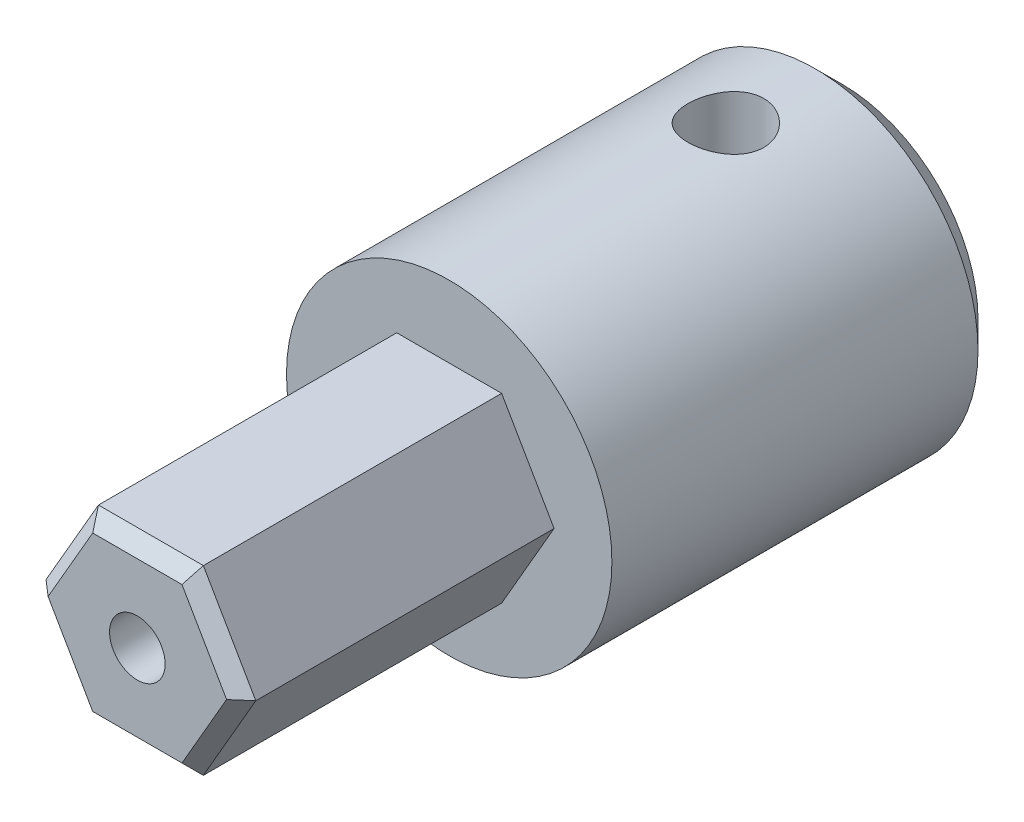
ISO-10303-21;
HEADER;
FILE_DESCRIPTION(('STEP AP214'),'2;1');
FILE_NAME('part.step','',(''),(''),'','','');
FILE_SCHEMA(('AUTOMOTIVE_DESIGN { 1 0 10303 214 1 1 1 1 }'));
ENDSEC;
DATA;
#1=APPLICATION_CONTEXT('core data for automotive mechanical design processes');
#2=APPLICATION_PROTOCOL_DEFINITION('international standard','automotive_design',2000,#1);
#3=PRODUCT_CONTEXT('',#1,'mechanical');
#4=PRODUCT('Part','Part','',(#3));
#5=PRODUCT_RELATED_PRODUCT_CATEGORY('part','',(#4));
#6=PRODUCT_DEFINITION_FORMATION('','',#4);
#7=PRODUCT_DEFINITION_CONTEXT('part definition',#1,'design');
#8=PRODUCT_DEFINITION('design','',#6,#7);
#9=PRODUCT_DEFINITION_SHAPE('','',#8);
#10=(LENGTH_UNIT() NAMED_UNIT(*) SI_UNIT(.MILLI.,.METRE.));
#11=(NAMED_UNIT(*) PLANE_ANGLE_UNIT() SI_UNIT($,.RADIAN.));
#12=(NAMED_UNIT(*) SI_UNIT($,.STERADIAN.) SOLID_ANGLE_UNIT());
#13=UNCERTAINTY_MEASURE_WITH_UNIT(LENGTH_MEASURE(1.E-05),#10,'distance_accuracy_value','');
#14=(GEOMETRIC_REPRESENTATION_CONTEXT(3) GLOBAL_UNCERTAINTY_ASSIGNED_CONTEXT((#13)) GLOBAL_UNIT_ASSIGNED_CONTEXT((#10,
#11,#12)) REPRESENTATION_CONTEXT('',''));
#15=CARTESIAN_POINT('',(0.,0.,0.));
#16=DIRECTION('',(0.,0.,1.));
#17=DIRECTION('',(1.,0.,0.));
#18=AXIS2_PLACEMENT_3D('',#15,#16,#17);
#19=CARTESIAN_POINT('',(0.,0.,14.5));
#20=DIRECTION('',(0.,0.,1.));
#21=DIRECTION('',(1.,0.,0.));
#22=AXIS2_PLACEMENT_3D('',#19,#20,#21);
#23=PLANE('',#22);
#24=CARTESIAN_POINT('',(0.,0.,14.5));
#25=DIRECTION('',(0.,0.,1.));
#26=DIRECTION('',(1.,0.,0.));
#27=AXIS2_PLACEMENT_3D('',#24,#25,#26);
#28=CIRCLE('',#27,6.);
#29=CARTESIAN_POINT('',(6.,0.,14.5));
#30=VERTEX_POINT('',#29);
#31=EDGE_CURVE('E164',#30,#30,#28,.T.);
#32=ORIENTED_EDGE('',*,*,#31,.T.);
#33=EDGE_LOOP('',(#32));
#34=FACE_BOUND('',#33,.T.);
#35=DIRECTION('',(-0.5,0.866025403784438,0.));
#36=VECTOR('',#35,1.);
#37=CARTESIAN_POINT('',(3.86824680357049,0.,14.5));
#38=LINE('',#37,#36);
#39=CARTESIAN_POINT('',(3.86824680357049,0.,14.5));
#40=VERTEX_POINT('',#39);
#41=CARTESIAN_POINT('',(1.93412340178525,3.35,14.5));
#42=VERTEX_POINT('',#41);
#43=EDGE_CURVE('E131',#40,#42,#38,.T.);
#44=ORIENTED_EDGE('',*,*,#43,.F.);
#45=DIRECTION('',(0.5,0.866025403784439,0.));
#46=VECTOR('',#45,1.);
#47=CARTESIAN_POINT('',(1.93412340178525,-3.35,14.5));
#48=LINE('',#47,#46);
#49=CARTESIAN_POINT('',(1.93412340178525,-3.35,14.5));
#50=VERTEX_POINT('',#49);
#51=EDGE_CURVE('E127',#50,#40,#48,.T.);
#52=ORIENTED_EDGE('',*,*,#51,.F.);
#53=DIRECTION('',(1.,0.,0.));
#54=VECTOR('',#53,1.);
#55=CARTESIAN_POINT('',(-1.93412340178524,-3.35,14.5));
#56=LINE('',#55,#54);
#57=CARTESIAN_POINT('',(-1.93412340178524,-3.35,14.5));
#58=VERTEX_POINT('',#57);
#59=EDGE_CURVE('E149',#58,#50,#56,.T.);
#60=ORIENTED_EDGE('',*,*,#59,.F.);
#61=DIRECTION('',(0.5,-0.866025403784439,0.));
#62=VECTOR('',#61,1.);
#63=CARTESIAN_POINT('',(-3.86824680357049,0.,14.5));
#64=LINE('',#63,#62);
#65=CARTESIAN_POINT('',(-3.86824680357049,0.,14.5));
#66=VERTEX_POINT('',#65);
#67=EDGE_CURVE('E146',#66,#58,#64,.T.);
#68=ORIENTED_EDGE('',*,*,#67,.F.);
#69=DIRECTION('',(-0.5,-0.866025403784439,0.));
#70=VECTOR('',#69,1.);
#71=CARTESIAN_POINT('',(-1.93412340178525,3.35,14.5));
#72=LINE('',#71,#70);
#73=CARTESIAN_POINT('',(-1.93412340178525,3.35,14.5));
#74=VERTEX_POINT('',#73);
#75=EDGE_CURVE('E143',#74,#66,#72,.T.);
#76=ORIENTED_EDGE('',*,*,#75,.F.);
#77=DIRECTION('',(-1.,0.,0.));
#78=VECTOR('',#77,1.);
#79=CARTESIAN_POINT('',(1.93412340178525,3.35,14.5));
#80=LINE('',#79,#78);
#81=EDGE_CURVE('E140',#42,#74,#80,.T.);
#82=ORIENTED_EDGE('',*,*,#81,.F.);
#83=EDGE_LOOP('',(#44,#52,#60,#68,#76,#82));
#84=FACE_BOUND('',#83,.T.);
#85=ADVANCED_FACE('F41',(#34,#84),#23,.T.);
#86=CARTESIAN_POINT('',(0.,0.,14.5));
#87=DIRECTION('',(0.,0.,-1.));
#88=DIRECTION('',(-1.,0.,0.));
#89=AXIS2_PLACEMENT_3D('',#86,#87,#88);
#90=CYLINDRICAL_SURFACE('',#89,6.);
#91=CARTESIAN_POINT('',(0.,6.,5.7));
#92=CARTESIAN_POINT('',(-0.0775136551808606,5.99999860462077,5.69999755049782));
#93=CARTESIAN_POINT('',(-0.155055852180418,5.99848277720664,5.69354075895642));
#94=CARTESIAN_POINT('',(-0.307928711689404,5.99258245110673,5.66791633869285));
#95=CARTESIAN_POINT('',(-0.383257908738774,5.98819609437492,5.64874047701852));
#96=CARTESIAN_POINT('',(-0.529474135819814,5.97704189804572,5.59831831024663));
#97=CARTESIAN_POINT('',(-0.600366020559868,5.97027671664972,5.5670854743364));
#98=CARTESIAN_POINT('',(-0.735902456221209,5.95509063862421,5.49348083405209));
#99=CARTESIAN_POINT('',(-0.800546997673411,5.94666973948518,5.45110901279503));
#100=CARTESIAN_POINT('',(-0.922925959248793,5.92892044055307,5.35561764001887));
#101=CARTESIAN_POINT('',(-0.980531045796355,5.91957951935363,5.30233465382949));
#102=CARTESIAN_POINT('',(-1.08607323847069,5.90112886617325,5.18688389689762));
#103=CARTESIAN_POINT('',(-1.13400938392729,5.89201915724322,5.12471524435569));
#104=CARTESIAN_POINT('',(-1.21944051732307,5.87493771504315,4.99227998295129));
#105=CARTESIAN_POINT('',(-1.25679466710317,5.86698196255307,4.92192027567549));
#106=CARTESIAN_POINT('',(-1.31909703704768,5.85329030120377,4.77570531126446));
#107=CARTESIAN_POINT('',(-1.34404696295362,5.84755408715332,4.69985081137895));
#108=CARTESIAN_POINT('',(-1.38039896443522,5.83907906254273,4.54621138233285));
#109=CARTESIAN_POINT('',(-1.39203167018675,5.83628929295491,4.46848389510076));
#110=CARTESIAN_POINT('',(-1.40213672759817,5.83387021717826,4.31213439110955));
#111=CARTESIAN_POINT('',(-1.40061093007045,5.83424046651614,4.23351250170633));
#112=CARTESIAN_POINT('',(-1.38462717006806,5.83805360607404,4.07934410285429));
#113=CARTESIAN_POINT('',(-1.37044019131594,5.84143210805626,4.00376766136065));
#114=CARTESIAN_POINT('',(-1.32996743878963,5.85077891648779,3.85609814039352));
#115=CARTESIAN_POINT('',(-1.30368090292846,5.85674738606409,3.78400528064847));
#116=CARTESIAN_POINT('',(-1.23951455308861,5.87066310630364,3.64460351510234));
#117=CARTESIAN_POINT('',(-1.20153320055199,5.87862756950202,3.57734313734968));
#118=CARTESIAN_POINT('',(-1.11512658099994,5.89562771298769,3.45005155389481));
#119=CARTESIAN_POINT('',(-1.06669970611106,5.90466355809567,3.39002146336614));
#120=CARTESIAN_POINT('',(-0.959356121021581,5.92306231054005,3.27733750874245));
#121=CARTESIAN_POINT('',(-0.900209750657103,5.93242778207154,3.2249025965754));
#122=CARTESIAN_POINT('',(-0.77385399055564,5.95022809072843,3.13065747543382));
#123=CARTESIAN_POINT('',(-0.706644412992491,5.95866290616614,3.08884751403005));
#124=CARTESIAN_POINT('',(-0.565782506984416,5.97368513329122,3.01697330824265));
#125=CARTESIAN_POINT('',(-0.492113392403212,5.98026753264178,2.986940847183));
#126=CARTESIAN_POINT('',(-0.340585615176868,5.99080645286014,2.93974428853492));
#127=CARTESIAN_POINT('',(-0.262727650306184,5.99476340961636,2.92257805477302));
#128=CARTESIAN_POINT('',(-0.106907588460029,5.99954244402773,2.90192686366759));
#129=CARTESIAN_POINT('',(-0.0289871166552409,6.00043294383207,2.89814324571886));
#130=CARTESIAN_POINT('',(0.126372845528744,5.99917188382708,2.90355083463075));
#131=CARTESIAN_POINT('',(0.203812372830683,5.99702056051609,2.9127410327916));
#132=CARTESIAN_POINT('',(0.355000856153422,5.98996106858808,2.94358830502789));
#133=CARTESIAN_POINT('',(0.428784148664062,5.9850881879476,2.96508588797508));
#134=CARTESIAN_POINT('',(0.571695899544113,5.97313240187964,3.0197583473677));
#135=CARTESIAN_POINT('',(0.640823925050003,5.96604929128104,3.0529343079297));
#136=CARTESIAN_POINT('',(0.773676865632761,5.95029195840437,3.13062430154547));
#137=CARTESIAN_POINT('',(0.837298480893235,5.9415942435686,3.17531010652239));
#138=CARTESIAN_POINT('',(0.956246790292011,5.92361520942204,3.27452818776418));
#139=CARTESIAN_POINT('',(1.01157224539757,5.91433380323009,3.3290619321447));
#140=CARTESIAN_POINT('',(1.11356143853837,5.89599253653189,3.44780629554065));
#141=CARTESIAN_POINT('',(1.16001705897302,5.88694152321121,3.51219730279702));
#142=CARTESIAN_POINT('',(1.24145867752415,5.87030791238069,3.64804081164209));
#143=CARTESIAN_POINT('',(1.27644518731706,5.8627252493689,3.71949299802219));
#144=CARTESIAN_POINT('',(1.33370534540389,5.84996505463622,3.86704045999628));
#145=CARTESIAN_POINT('',(1.35605325740337,5.84477350703677,3.94310564180338));
#146=CARTESIAN_POINT('',(1.38761099409425,5.83736270589205,4.09805048375049));
#147=CARTESIAN_POINT('',(1.39682325969457,5.83514290013266,4.17692961819947));
#148=CARTESIAN_POINT('',(1.40173339100697,5.8339650668052,4.3331565495));
#149=CARTESIAN_POINT('',(1.39776234943619,5.83492712585111,4.41049351644876));
#150=CARTESIAN_POINT('',(1.3771667082819,5.83982206816927,4.56336303979087));
#151=CARTESIAN_POINT('',(1.36054230260668,5.84375490591538,4.63889562381744));
#152=CARTESIAN_POINT('',(1.31528151618139,5.85410673416447,4.78570549046038));
#153=CARTESIAN_POINT('',(1.28669962480293,5.86051443684697,4.85700042145178));
#154=CARTESIAN_POINT('',(1.21837986841269,5.87509704008543,4.99382999595179));
#155=CARTESIAN_POINT('',(1.17864066141223,5.88327215319622,5.05936394529051));
#156=CARTESIAN_POINT('',(1.08806343467475,5.90070227653375,5.18442910308178));
#157=CARTESIAN_POINT('',(1.03699221748307,5.9099777197338,5.24378860408993));
#158=CARTESIAN_POINT('',(0.925665237986201,5.92843331002946,5.35320306160817));
#159=CARTESIAN_POINT('',(0.865407334621452,5.93761343437582,5.40325584303191));
#160=CARTESIAN_POINT('',(0.736311376134254,5.95501024549108,5.49337181261718));
#161=CARTESIAN_POINT('',(0.667356718680485,5.96321014750897,5.53327141389703));
#162=CARTESIAN_POINT('',(0.523538263687531,5.97755068140178,5.60084956861957));
#163=CARTESIAN_POINT('',(0.448679156038938,5.98369292771758,5.62853770862458));
#164=CARTESIAN_POINT('',(0.311528184180862,5.99221392489556,5.66634021560558));
#165=CARTESIAN_POINT('',(0.249940948576285,5.99511474612675,5.67893714788107));
#166=CARTESIAN_POINT('',(0.125575340933341,5.99900829461443,5.69576779433718));
#167=CARTESIAN_POINT('',(0.0627970368842884,6.00000113045477,5.70000198444363));
#168=CARTESIAN_POINT('',(0.,6.,5.7));
#169=B_SPLINE_CURVE_WITH_KNOTS('',3,(#91,#92,#93,#94,#95,#96,#97,#98,#99,#100,#101,#102,#103,
#104,#105,#106,#107,#108,#109,#110,#111,#112,#113,#114,#115,#116,#117,#118,#119,#120,#121,#122,
#123,#124,#125,#126,#127,#128,#129,#130,#131,#132,#133,#134,#135,#136,#137,#138,#139,#140,#141,
#142,#143,#144,#145,#146,#147,#148,#149,#150,#151,#152,#153,#154,#155,#156,#157,#158,#159,#160,
#161,#162,#163,#164,#165,#166,#167,#168),.UNSPECIFIED.,.T.,.F.,(4,2,2,2,2,2,2,2,2,2,2,2,2,2,2,2,
2,2,2,2,2,2,2,2,2,2,2,2,2,2,2,2,2,2,2,2,2,2,4),(0.,0.232310985919359,0.464772491816953,
0.696975056396176,0.929177972918811,1.16515351438317,1.4011524899667,1.64015884953452,
1.87913233353337,2.11390145918228,2.34863756386325,2.57846705193038,2.8083110177202,
3.04020969694585,3.27214409771247,3.50981031406085,3.74748206773496,3.98579087118959,
4.22406009957936,4.45697708738846,4.68987596715844,4.9198229082951,5.14979120128962,
5.38341339123567,5.61707043801289,5.85567302562694,6.09426496691076,6.33143998718595,
6.5685709290746,6.79979193674362,7.03100940110476,7.26118450774941,7.49138731145205,
7.72685864048367,7.9623849328642,8.20149492533847,8.44041686981216,8.62863237610634,
8.81683717069852),.UNSPECIFIED.);
#170=CARTESIAN_POINT('',(0.,6.,5.7));
#171=VERTEX_POINT('',#170);
#172=EDGE_CURVE('E199',#171,#171,#169,.T.);
#173=ORIENTED_EDGE('',*,*,#172,.T.);
#174=EDGE_LOOP('',(#173));
#175=FACE_BOUND('',#174,.T.);
#176=CARTESIAN_POINT('',(0.,0.,1.00000000000002));
#177=DIRECTION('',(0.,0.,1.));
#178=DIRECTION('',(1.,0.,0.));
#179=AXIS2_PLACEMENT_3D('',#176,#177,#178);
#180=CIRCLE('',#179,6.);
#181=CARTESIAN_POINT('',(6.,0.,1.00000000000002));
#182=VERTEX_POINT('',#181);
#183=EDGE_CURVE('E167',#182,#182,#180,.T.);
#184=ORIENTED_EDGE('',*,*,#183,.T.);
#185=EDGE_LOOP('',(#184));
#186=FACE_BOUND('',#185,.T.);
#187=ORIENTED_EDGE('',*,*,#31,.F.);
#188=EDGE_LOOP('',(#187));
#189=FACE_BOUND('',#188,.T.);
#190=ADVANCED_FACE('F225',(#175,#186,#189),#90,.T.);
#191=CARTESIAN_POINT('',(0.,0.,0.));
#192=DIRECTION('',(0.,0.,1.));
#193=DIRECTION('',(1.,0.,0.));
#194=AXIS2_PLACEMENT_3D('',#191,#192,#193);
#195=PLANE('',#194);
#196=CARTESIAN_POINT('',(0.,0.,0.));
#197=DIRECTION('',(0.,0.,1.));
#198=DIRECTION('',(1.,0.,0.));
#199=AXIS2_PLACEMENT_3D('',#196,#197,#198);
#200=CIRCLE('',#199,4.99999999999998);
#201=CARTESIAN_POINT('',(4.99999999999998,0.,0.));
#202=VERTEX_POINT('',#201);
#203=EDGE_CURVE('E170',#202,#202,#200,.F.);
#204=ORIENTED_EDGE('',*,*,#203,.T.);
#205=EDGE_LOOP('',(#204));
#206=FACE_BOUND('',#205,.T.);
#207=CARTESIAN_POINT('',(0.,0.,0.));
#208=DIRECTION('',(0.,0.,-1.));
#209=DIRECTION('',(-1.,0.,0.));
#210=AXIS2_PLACEMENT_3D('',#207,#208,#209);
#211=CIRCLE('',#210,3.);
#212=CARTESIAN_POINT('',(-3.,0.,0.));
#213=VERTEX_POINT('',#212);
#214=EDGE_CURVE('E211',#213,#213,#211,.T.);
#215=ORIENTED_EDGE('',*,*,#214,.F.);
#216=EDGE_LOOP('',(#215));
#217=FACE_BOUND('',#216,.T.);
#218=ADVANCED_FACE('F271',(#206,#217),#195,.F.);
#219=CARTESIAN_POINT('',(1.93412340178525,-3.35,26.));
#220=DIRECTION('',(-0.866025403784439,0.5,0.));
#221=DIRECTION('',(-0.5,-0.866025403784439,0.));
#222=AXIS2_PLACEMENT_3D('',#219,#220,#221);
#223=PLANE('',#222);
#224=DIRECTION('',(0.,0.,-1.));
#225=VECTOR('',#224,1.);
#226=CARTESIAN_POINT('',(3.86824680357049,0.,26.));
#227=LINE('',#226,#225);
#228=CARTESIAN_POINT('',(3.86824680357049,0.,25.5));
#229=VERTEX_POINT('',#228);
#230=EDGE_CURVE('E162',#229,#40,#227,.T.);
#231=ORIENTED_EDGE('',*,*,#230,.F.);
#232=DIRECTION('',(-0.5,-0.866025403784439,0.));
#233=VECTOR('',#232,1.);
#234=CARTESIAN_POINT('',(1.93412340178525,-3.35,25.5));
#235=LINE('',#234,#233);
#236=CARTESIAN_POINT('',(1.93412340178525,-3.35,25.5));
#237=VERTEX_POINT('',#236);
#238=EDGE_CURVE('E193',#229,#237,#235,.T.);
#239=ORIENTED_EDGE('',*,*,#238,.T.);
#240=DIRECTION('',(0.,0.,-1.));
#241=VECTOR('',#240,1.);
#242=CARTESIAN_POINT('',(1.93412340178525,-3.35,26.));
#243=LINE('',#242,#241);
#244=EDGE_CURVE('E152',#237,#50,#243,.T.);
#245=ORIENTED_EDGE('',*,*,#244,.T.);
#246=ORIENTED_EDGE('',*,*,#51,.T.);
#247=EDGE_LOOP('',(#231,#239,#245,#246));
#248=FACE_BOUND('',#247,.T.);
#249=ADVANCED_FACE('F268',(#248),#223,.F.);
#250=CARTESIAN_POINT('',(3.86824680357049,0.,26.));
#251=DIRECTION('',(-0.866025403784438,-0.5,0.));
#252=DIRECTION('',(0.5,-0.866025403784438,0.));
#253=AXIS2_PLACEMENT_3D('',#250,#251,#252);
#254=PLANE('',#253);
#255=DIRECTION('',(0.,0.,-1.));
#256=VECTOR('',#255,1.);
#257=CARTESIAN_POINT('',(1.93412340178525,3.35,26.));
#258=LINE('',#257,#256);
#259=CARTESIAN_POINT('',(1.93412340178525,3.35,25.5));
#260=VERTEX_POINT('',#259);
#261=EDGE_CURVE('E160',#260,#42,#258,.T.);
#262=ORIENTED_EDGE('',*,*,#261,.F.);
#263=DIRECTION('',(0.5,-0.866025403784438,0.));
#264=VECTOR('',#263,1.);
#265=CARTESIAN_POINT('',(3.86824680357049,0.,25.5));
#266=LINE('',#265,#264);
#267=EDGE_CURVE('E54',#260,#229,#266,.T.);
#268=ORIENTED_EDGE('',*,*,#267,.T.);
#269=ORIENTED_EDGE('',*,*,#230,.T.);
#270=ORIENTED_EDGE('',*,*,#43,.T.);
#271=EDGE_LOOP('',(#262,#268,#269,#270));
#272=FACE_BOUND('',#271,.T.);
#273=ADVANCED_FACE('F265',(#272),#254,.F.);
#274=CARTESIAN_POINT('',(1.93412340178525,3.35,26.));
#275=DIRECTION('',(0.,-1.,0.));
#276=DIRECTION('',(0.,0.,-1.));
#277=AXIS2_PLACEMENT_3D('',#274,#275,#276);
#278=PLANE('',#277);
#279=DIRECTION('',(0.,0.,-1.));
#280=VECTOR('',#279,1.);
#281=CARTESIAN_POINT('',(-1.93412340178525,3.35,26.));
#282=LINE('',#281,#280);
#283=CARTESIAN_POINT('',(-1.93412340178525,3.35,25.5));
#284=VERTEX_POINT('',#283);
#285=EDGE_CURVE('E158',#284,#74,#282,.T.);
#286=ORIENTED_EDGE('',*,*,#285,.F.);
#287=DIRECTION('',(1.,0.,0.));
#288=VECTOR('',#287,1.);
#289=CARTESIAN_POINT('',(1.93412340178525,3.35,25.5));
#290=LINE('',#289,#288);
#291=EDGE_CURVE('E11',#284,#260,#290,.T.);
#292=ORIENTED_EDGE('',*,*,#291,.T.);
#293=ORIENTED_EDGE('',*,*,#261,.T.);
#294=ORIENTED_EDGE('',*,*,#81,.T.);
#295=EDGE_LOOP('',(#286,#292,#293,#294));
#296=FACE_BOUND('',#295,.T.);
#297=ADVANCED_FACE('F261',(#296),#278,.F.);
#298=CARTESIAN_POINT('',(-1.93412340178525,3.35,26.));
#299=DIRECTION('',(0.866025403784439,-0.5,0.));
#300=DIRECTION('',(0.5,0.866025403784439,0.));
#301=AXIS2_PLACEMENT_3D('',#298,#299,#300);
#302=PLANE('',#301);
#303=DIRECTION('',(0.,0.,-1.));
#304=VECTOR('',#303,1.);
#305=CARTESIAN_POINT('',(-3.86824680357049,0.,26.));
#306=LINE('',#305,#304);
#307=CARTESIAN_POINT('',(-3.86824680357049,0.,25.5));
#308=VERTEX_POINT('',#307);
#309=EDGE_CURVE('E156',#308,#66,#306,.T.);
#310=ORIENTED_EDGE('',*,*,#309,.F.);
#311=DIRECTION('',(0.5,0.866025403784439,0.));
#312=VECTOR('',#311,1.);
#313=CARTESIAN_POINT('',(-1.93412340178525,3.35,25.5));
#314=LINE('',#313,#312);
#315=EDGE_CURVE('E186',#308,#284,#314,.T.);
#316=ORIENTED_EDGE('',*,*,#315,.T.);
#317=ORIENTED_EDGE('',*,*,#285,.T.);
#318=ORIENTED_EDGE('',*,*,#75,.T.);
#319=EDGE_LOOP('',(#310,#316,#317,#318));
#320=FACE_BOUND('',#319,.T.);
#321=ADVANCED_FACE('F257',(#320),#302,.F.);
#322=CARTESIAN_POINT('',(-3.86824680357049,0.,26.));
#323=DIRECTION('',(0.866025403784439,0.5,0.));
#324=DIRECTION('',(-0.5,0.866025403784439,0.));
#325=AXIS2_PLACEMENT_3D('',#322,#323,#324);
#326=PLANE('',#325);
#327=DIRECTION('',(0.,0.,-1.));
#328=VECTOR('',#327,1.);
#329=CARTESIAN_POINT('',(-1.93412340178524,-3.35,26.));
#330=LINE('',#329,#328);
#331=CARTESIAN_POINT('',(-1.93412340178524,-3.35,25.5));
#332=VERTEX_POINT('',#331);
#333=EDGE_CURVE('E154',#332,#58,#330,.T.);
#334=ORIENTED_EDGE('',*,*,#333,.F.);
#335=DIRECTION('',(-0.5,0.866025403784439,0.));
#336=VECTOR('',#335,1.);
#337=CARTESIAN_POINT('',(-3.86824680357049,0.,25.5));
#338=LINE('',#337,#336);
#339=EDGE_CURVE('E189',#332,#308,#338,.T.);
#340=ORIENTED_EDGE('',*,*,#339,.T.);
#341=ORIENTED_EDGE('',*,*,#309,.T.);
#342=ORIENTED_EDGE('',*,*,#67,.T.);
#343=EDGE_LOOP('',(#334,#340,#341,#342));
#344=FACE_BOUND('',#343,.T.);
#345=ADVANCED_FACE('F253',(#344),#326,.F.);
#346=CARTESIAN_POINT('',(-1.93412340178524,-3.35,26.));
#347=DIRECTION('',(0.,1.,0.));
#348=DIRECTION('',(-1.,0.,0.));
#349=AXIS2_PLACEMENT_3D('',#346,#347,#348);
#350=PLANE('',#349);
#351=ORIENTED_EDGE('',*,*,#244,.F.);
#352=DIRECTION('',(-1.,0.,0.));
#353=VECTOR('',#352,1.);
#354=CARTESIAN_POINT('',(-1.93412340178524,-3.35,25.5));
#355=LINE('',#354,#353);
#356=EDGE_CURVE('E191',#237,#332,#355,.T.);
#357=ORIENTED_EDGE('',*,*,#356,.T.);
#358=ORIENTED_EDGE('',*,*,#333,.T.);
#359=ORIENTED_EDGE('',*,*,#59,.T.);
#360=EDGE_LOOP('',(#351,#357,#358,#359));
#361=FACE_BOUND('',#360,.T.);
#362=ADVANCED_FACE('F249',(#361),#350,.F.);
#363=CARTESIAN_POINT('',(0.,0.,26.));
#364=DIRECTION('',(0.,0.,1.));
#365=DIRECTION('',(1.,0.,0.));
#366=AXIS2_PLACEMENT_3D('',#363,#364,#365);
#367=PLANE('',#366);
#368=DIRECTION('',(-1.,0.,0.));
#369=VECTOR('',#368,1.);
#370=CARTESIAN_POINT('',(-1.93412340178525,2.85,26.));
#371=LINE('',#370,#369);
#372=CARTESIAN_POINT('',(1.64544826719043,2.85,26.));
#373=VERTEX_POINT('',#372);
#374=CARTESIAN_POINT('',(-1.64544826719043,2.85,26.));
#375=VERTEX_POINT('',#374);
#376=EDGE_CURVE('E173',#373,#375,#371,.T.);
#377=ORIENTED_EDGE('',*,*,#376,.T.);
#378=DIRECTION('',(-0.5,-0.866025403784439,0.));
#379=VECTOR('',#378,1.);
#380=CARTESIAN_POINT('',(-3.43523410167827,-0.250000000000001,26.));
#381=LINE('',#380,#379);
#382=CARTESIAN_POINT('',(-3.29089653438086,0.,26.));
#383=VERTEX_POINT('',#382);
#384=EDGE_CURVE('E183',#375,#383,#381,.T.);
#385=ORIENTED_EDGE('',*,*,#384,.T.);
#386=DIRECTION('',(0.5,-0.866025403784439,0.));
#387=VECTOR('',#386,1.);
#388=CARTESIAN_POINT('',(-1.50111069989302,-3.1,26.));
#389=LINE('',#388,#387);
#390=CARTESIAN_POINT('',(-1.64544826719043,-2.85,26.));
#391=VERTEX_POINT('',#390);
#392=EDGE_CURVE('E181',#383,#391,#389,.T.);
#393=ORIENTED_EDGE('',*,*,#392,.T.);
#394=DIRECTION('',(1.,0.,0.));
#395=VECTOR('',#394,1.);
#396=CARTESIAN_POINT('',(1.93412340178525,-2.85,26.));
#397=LINE('',#396,#395);
#398=CARTESIAN_POINT('',(1.64544826719043,-2.85,26.));
#399=VERTEX_POINT('',#398);
#400=EDGE_CURVE('E179',#391,#399,#397,.T.);
#401=ORIENTED_EDGE('',*,*,#400,.T.);
#402=DIRECTION('',(0.5,0.866025403784439,0.));
#403=VECTOR('',#402,1.);
#404=CARTESIAN_POINT('',(3.43523410167827,0.250000000000003,26.));
#405=LINE('',#404,#403);
#406=CARTESIAN_POINT('',(3.29089653438086,0.,26.));
#407=VERTEX_POINT('',#406);
#408=EDGE_CURVE('E177',#399,#407,#405,.T.);
#409=ORIENTED_EDGE('',*,*,#408,.T.);
#410=DIRECTION('',(-0.5,0.866025403784438,0.));
#411=VECTOR('',#410,1.);
#412=CARTESIAN_POINT('',(1.50111069989302,3.1,26.));
#413=LINE('',#412,#411);
#414=EDGE_CURVE('E175',#407,#373,#413,.T.);
#415=ORIENTED_EDGE('',*,*,#414,.T.);
#416=EDGE_LOOP('',(#377,#385,#393,#401,#409,#415));
#417=FACE_BOUND('',#416,.T.);
#418=CARTESIAN_POINT('',(0.,0.,26.));
#419=DIRECTION('',(0.,0.,1.));
#420=DIRECTION('',(1.,0.,0.));
#421=AXIS2_PLACEMENT_3D('',#418,#419,#420);
#422=CIRCLE('',#421,1.025);
#423=CARTESIAN_POINT('',(1.025,0.,26.));
#424=VERTEX_POINT('',#423);
#425=EDGE_CURVE('E128',#424,#424,#422,.T.);
#426=ORIENTED_EDGE('',*,*,#425,.F.);
#427=EDGE_LOOP('',(#426));
#428=FACE_BOUND('',#427,.T.);
#429=ADVANCED_FACE('F121',(#417,#428),#367,.T.);
#430=CARTESIAN_POINT('',(0.,0.,15.));
#431=DIRECTION('',(0.,0.,1.));
#432=DIRECTION('',(1.,0.,0.));
#433=AXIS2_PLACEMENT_3D('',#430,#431,#432);
#434=CONICAL_SURFACE('',#433,1.025,1.02974425867665);
#435=CARTESIAN_POINT('',(0.,0.,14.3841178654968));
#436=VERTEX_POINT('',#435);
#437=VERTEX_LOOP('',#436);
#438=FACE_BOUND('',#437,.T.);
#439=CARTESIAN_POINT('',(0.,0.,15.));
#440=DIRECTION('',(0.,0.,1.));
#441=DIRECTION('',(1.,0.,0.));
#442=AXIS2_PLACEMENT_3D('',#439,#440,#441);
#443=CIRCLE('',#442,1.025);
#444=CARTESIAN_POINT('',(1.025,0.,15.));
#445=VERTEX_POINT('',#444);
#446=EDGE_CURVE('E125',#445,#445,#443,.T.);
#447=ORIENTED_EDGE('',*,*,#446,.T.);
#448=EDGE_LOOP('',(#447));
#449=FACE_BOUND('',#448,.T.);
#450=ADVANCED_FACE('F117',(#438,#449),#434,.F.);
#451=CARTESIAN_POINT('',(0.,0.,26.));
#452=DIRECTION('',(0.,0.,1.));
#453=DIRECTION('',(1.,0.,0.));
#454=AXIS2_PLACEMENT_3D('',#451,#452,#453);
#455=CYLINDRICAL_SURFACE('',#454,1.025);
#456=ORIENTED_EDGE('',*,*,#446,.F.);
#457=EDGE_LOOP('',(#456));
#458=FACE_BOUND('',#457,.T.);
#459=ORIENTED_EDGE('',*,*,#425,.T.);
#460=EDGE_LOOP('',(#459));
#461=FACE_BOUND('',#460,.T.);
#462=ADVANCED_FACE('F120',(#458,#461),#455,.F.);
#463=CARTESIAN_POINT('',(0.,0.,12.));
#464=DIRECTION('',(0.,0.,-1.));
#465=DIRECTION('',(-1.,0.,0.));
#466=AXIS2_PLACEMENT_3D('',#463,#464,#465);
#467=CYLINDRICAL_SURFACE('',#466,3.);
#468=CARTESIAN_POINT('',(0.,3.,5.7));
#469=CARTESIAN_POINT('',(0.074176014195853,2.9999965985567,5.69999594944587));
#470=CARTESIAN_POINT('',(0.148457438343158,2.99721866421499,5.69407017916472));
#471=CARTESIAN_POINT('',(0.294860958042639,2.98638133101226,5.67061224072665));
#472=CARTESIAN_POINT('',(0.366977899485661,2.97831023303417,5.65305436203902));
#473=CARTESIAN_POINT('',(0.506705207958354,2.95773878056305,5.60714824486611));
#474=CARTESIAN_POINT('',(0.574331184032727,2.94525483671525,5.57883995676572));
#475=CARTESIAN_POINT('',(0.703790652559756,2.91703179641225,5.5124256993013));
#476=CARTESIAN_POINT('',(0.765625113804208,2.90129324579851,5.47432137260479));
#477=CARTESIAN_POINT('',(0.88555601823268,2.86703510505487,5.38700931632246));
#478=CARTESIAN_POINT('',(0.943262854198596,2.84841047078529,5.33730816073341));
#479=CARTESIAN_POINT('',(1.04987206669058,2.81086626705385,5.22926581284594));
#480=CARTESIAN_POINT('',(1.09876864666266,2.79194651225135,5.17091897793868));
#481=CARTESIAN_POINT('',(1.18954928643585,2.75454886272565,5.04265632770077));
#482=CARTESIAN_POINT('',(1.23076801131511,2.73618026181933,4.97223417349252));
#483=CARTESIAN_POINT('',(1.30060459631542,2.70368671328043,4.82449166583378));
#484=CARTESIAN_POINT('',(1.32923050054668,2.68955905843085,4.74717575409304));
#485=CARTESIAN_POINT('',(1.37136389166292,2.66831280778357,4.5922913308142));
#486=CARTESIAN_POINT('',(1.38562630954338,2.66084688805232,4.51497798660206));
#487=CARTESIAN_POINT('',(1.4009643178012,2.65280653141493,4.3587238445313));
#488=CARTESIAN_POINT('',(1.4020501890138,2.65222672171534,4.27978436362683));
#489=CARTESIAN_POINT('',(1.39156325474428,2.6577381391041,4.13104782259268));
#490=CARTESIAN_POINT('',(1.38125548710099,2.66316277668237,4.06113132367479));
#491=CARTESIAN_POINT('',(1.35043639237287,2.67892103840313,3.92416592160718));
#492=CARTESIAN_POINT('',(1.32992244300339,2.68925592410991,3.85711776023274));
#493=CARTESIAN_POINT('',(1.27887161255287,2.71390923378543,3.72592780866886));
#494=CARTESIAN_POINT('',(1.24811450695909,2.7283140240837,3.66188869599852));
#495=CARTESIAN_POINT('',(1.17761205733664,2.75947702819645,3.53959400364931));
#496=CARTESIAN_POINT('',(1.13786278548149,2.77623626923161,3.48134096740936));
#497=CARTESIAN_POINT('',(1.04545769592096,2.81242518177222,3.36561325724133));
#498=CARTESIAN_POINT('',(0.991869135627383,2.83194722846672,3.30890981132952));
#499=CARTESIAN_POINT('',(0.875809338201,2.86996272516678,3.20499883889947));
#500=CARTESIAN_POINT('',(0.813334864133947,2.88845579691007,3.15779478799144));
#501=CARTESIAN_POINT('',(0.678420066791912,2.92314231667083,3.07267474199008));
#502=CARTESIAN_POINT('',(0.60570404390301,2.9392303997136,3.03514943953424));
#503=CARTESIAN_POINT('',(0.454047875045106,2.9664385628126,2.97314728148889));
#504=CARTESIAN_POINT('',(0.375112098848905,2.97756209480586,2.94866135710182));
#505=CARTESIAN_POINT('',(0.219630179590063,2.99289168727817,2.91522461451369));
#506=CARTESIAN_POINT('',(0.143350867486889,2.99755511855446,2.90524384224663));
#507=CARTESIAN_POINT('',(-0.00993159603062652,3.00096130674055,2.89793666008045));
#508=CARTESIAN_POINT('',(-0.0869344549310047,2.99970636153703,2.90060533886939));
#509=CARTESIAN_POINT('',(-0.234138662301146,2.99169876992405,2.91785977225628));
#510=CARTESIAN_POINT('',(-0.304455247280262,2.98531143610107,2.93165387927403));
#511=CARTESIAN_POINT('',(-0.441661374952198,2.9681169868393,2.96958529647006));
#512=CARTESIAN_POINT('',(-0.508550515457683,2.95730935403885,2.99372381739748));
#513=CARTESIAN_POINT('',(-0.639346310572959,2.93186182190092,3.05238939988832));
#514=CARTESIAN_POINT('',(-0.703098749779368,2.91711463217098,3.08721214998557));
#515=CARTESIAN_POINT('',(-0.824081336424188,2.88527461622476,3.16593442705304));
#516=CARTESIAN_POINT('',(-0.881308600637792,2.86818076040266,3.20983794254021));
#517=CARTESIAN_POINT('',(-0.992927203863406,2.83157928041133,3.30995057808188));
#518=CARTESIAN_POINT('',(-1.04662821994276,2.81199150907127,3.36690174669527));
#519=CARTESIAN_POINT('',(-1.14397488618524,2.7738171204936,3.48917794714694));
#520=CARTESIAN_POINT('',(-1.18761573536873,2.7552309844915,3.55450695406384));
#521=CARTESIAN_POINT('',(-1.26487258942864,2.72065279755534,3.6944537387633));
#522=CARTESIAN_POINT('',(-1.29811762077689,2.70476441122083,3.7693040329686));
#523=CARTESIAN_POINT('',(-1.35119476914698,2.67864935946574,3.9245260622962));
#524=CARTESIAN_POINT('',(-1.37104172650419,2.6684164320798,4.00489157939704));
#525=CARTESIAN_POINT('',(-1.39512361569359,2.65589863089785,4.16107554771441));
#526=CARTESIAN_POINT('',(-1.40060458275626,2.65298045006346,4.23665086073106));
#527=CARTESIAN_POINT('',(-1.39928993042139,2.65367487263324,4.38765382327));
#528=CARTESIAN_POINT('',(-1.39249775922279,2.65728564169681,4.46308150830889));
#529=CARTESIAN_POINT('',(-1.36795238910772,2.66999487603889,4.60590006248366));
#530=CARTESIAN_POINT('',(-1.35103435582631,2.67867409395688,4.67347595929578));
#531=CARTESIAN_POINT('',(-1.30765598987226,2.70011439829818,4.80479828460279));
#532=CARTESIAN_POINT('',(-1.28119281477063,2.71287670048705,4.86854356578271));
#533=CARTESIAN_POINT('',(-1.21748406199402,2.74208602331761,4.9950365450524));
#534=CARTESIAN_POINT('',(-1.1796403806501,2.75872111955289,5.05743847762141));
#535=CARTESIAN_POINT('',(-1.0949742620724,2.79340714138716,5.17538981444124));
#536=CARTESIAN_POINT('',(-1.04814763276814,2.81145872568485,5.23093599935386));
#537=CARTESIAN_POINT('',(-0.941307680520032,2.8491150891186,5.33937361999567));
#538=CARTESIAN_POINT('',(-0.880442612871034,2.86869394428718,5.3914392587178));
#539=CARTESIAN_POINT('',(-0.750199086477079,2.90547332461736,5.48474343285123));
#540=CARTESIAN_POINT('',(-0.680816600685455,2.92267271652822,5.52597681760483));
#541=CARTESIAN_POINT('',(-0.535611024288787,2.95272548252542,5.59598749798326));
#542=CARTESIAN_POINT('',(-0.459824309977942,2.96560157678301,5.62483014166356));
#543=CARTESIAN_POINT('',(-0.30382274262725,2.98560363061672,5.66902274354933));
#544=CARTESIAN_POINT('',(-0.223621832238216,2.99274669700571,5.68441285517442));
#545=CARTESIAN_POINT('',(-0.118989792805176,2.99773444736987,5.69513901457568));
#546=CARTESIAN_POINT('',(-0.0952397688918321,2.99858232619917,5.69695990001916));
#547=CARTESIAN_POINT('',(-0.0476634596251041,2.99971565466794,5.69939105564998));
#548=CARTESIAN_POINT('',(-0.0238371727597293,3.00000109308639,5.70000130168437));
#549=CARTESIAN_POINT('',(0.,3.,5.7));
#550=B_SPLINE_CURVE_WITH_KNOTS('',3,(#468,#469,#470,#471,#472,#473,#474,#475,#476,#477,#478,
#479,#480,#481,#482,#483,#484,#485,#486,#487,#488,#489,#490,#491,#492,#493,#494,#495,#496,#497,
#498,#499,#500,#501,#502,#503,#504,#505,#506,#507,#508,#509,#510,#511,#512,#513,#514,#515,#516,
#517,#518,#519,#520,#521,#522,#523,#524,#525,#526,#527,#528,#529,#530,#531,#532,#533,#534,#535,
#536,#537,#538,#539,#540,#541,#542,#543,#544,#545,#546,#547,#548,#549),.UNSPECIFIED.,.T.,.F.,(4,
2,2,2,2,2,2,2,2,2,2,2,2,2,2,2,2,2,2,2,2,2,2,2,2,2,2,2,2,2,2,2,2,2,2,2,2,2,2,2,4),(0.,
0.222430614227101,0.445354516020345,0.667457974459497,0.889524213319483,1.12374008349084,
1.3581094936473,1.60776429290693,1.8572593839249,2.09282314699248,2.32820310256044,
2.53985531348055,2.75156193252273,2.96815060600377,3.18483406988205,3.42504393482463,
3.66534152788207,3.91419776760519,4.16288070273416,4.392858842168,4.62274769694935,
4.83758576938905,5.05244899415581,5.27389671638204,5.49544191175845,5.73644174754947,
5.97755635787823,6.22648976232309,6.47514698203737,6.70138965858241,6.92756878101078,
7.13725924988263,7.34701221368888,7.57065894835865,7.79441030722339,8.0406156991707,
8.28693794895593,8.53194466707524,8.7762175616393,8.84769634435319,8.9191765530954),.UNSPECIFIED.);
#551=CARTESIAN_POINT('',(0.,3.,5.7));
#552=VERTEX_POINT('',#551);
#553=EDGE_CURVE('E45',#552,#552,#550,.T.);
#554=ORIENTED_EDGE('',*,*,#553,.T.);
#555=EDGE_LOOP('',(#554));
#556=FACE_BOUND('',#555,.T.);
#557=CARTESIAN_POINT('',(0.,0.,12.));
#558=DIRECTION('',(0.,0.,-1.));
#559=DIRECTION('',(-1.,0.,0.));
#560=AXIS2_PLACEMENT_3D('',#557,#558,#559);
#561=CIRCLE('',#560,3.);
#562=CARTESIAN_POINT('',(-3.,0.,12.));
#563=VERTEX_POINT('',#562);
#564=EDGE_CURVE('E134',#563,#563,#561,.T.);
#565=ORIENTED_EDGE('',*,*,#564,.F.);
#566=EDGE_LOOP('',(#565));
#567=FACE_BOUND('',#566,.T.);
#568=ORIENTED_EDGE('',*,*,#214,.T.);
#569=EDGE_LOOP('',(#568));
#570=FACE_BOUND('',#569,.T.);
#571=ADVANCED_FACE('F239',(#556,#567,#570),#467,.F.);
#572=CARTESIAN_POINT('',(0.,0.,12.));
#573=DIRECTION('',(0.,0.,-1.));
#574=DIRECTION('',(-1.,0.,0.));
#575=AXIS2_PLACEMENT_3D('',#572,#573,#574);
#576=PLANE('',#575);
#577=ORIENTED_EDGE('',*,*,#564,.T.);
#578=EDGE_LOOP('',(#577));
#579=FACE_BOUND('',#578,.T.);
#580=ADVANCED_FACE('F235',(#579),#576,.T.);
#581=CARTESIAN_POINT('',(0.,0.,1.00000000000002));
#582=DIRECTION('',(0.,0.,1.));
#583=DIRECTION('',(1.,0.,0.));
#584=AXIS2_PLACEMENT_3D('',#581,#582,#583);
#585=CONICAL_SURFACE('',#584,6.,0.785398163397449);
#586=ORIENTED_EDGE('',*,*,#203,.F.);
#587=EDGE_LOOP('',(#586));
#588=FACE_BOUND('',#587,.T.);
#589=ORIENTED_EDGE('',*,*,#183,.F.);
#590=EDGE_LOOP('',(#589));
#591=FACE_BOUND('',#590,.T.);
#592=ADVANCED_FACE('F238',(#588,#591),#585,.T.);
#593=CARTESIAN_POINT('',(2.46817240078565,-1.425,26.));
#594=DIRECTION('',(0.612372435695795,-0.353553390593274,0.707106781186547));
#595=DIRECTION('',(-0.5,-0.866025403784439,0.));
#596=AXIS2_PLACEMENT_3D('',#593,#594,#595);
#597=PLANE('',#596);
#598=DIRECTION('',(0.377964473009227,-0.654653670707977,-0.654653670707977));
#599=VECTOR('',#598,1.);
#600=CARTESIAN_POINT('',(1.41038422902037,-2.44285714285714,26.4071428571429));
#601=LINE('',#600,#599);
#602=EDGE_CURVE('E207',#237,#399,#601,.F.);
#603=ORIENTED_EDGE('',*,*,#602,.F.);
#604=ORIENTED_EDGE('',*,*,#238,.F.);
#605=DIRECTION('',(0.755928946018454,0.,-0.654653670707977));
#606=VECTOR('',#605,1.);
#607=CARTESIAN_POINT('',(2.82076845804074,0.,26.4071428571429));
#608=LINE('',#607,#606);
#609=EDGE_CURVE('E209',#407,#229,#608,.T.);
#610=ORIENTED_EDGE('',*,*,#609,.F.);
#611=ORIENTED_EDGE('',*,*,#408,.F.);
#612=EDGE_LOOP('',(#603,#604,#610,#611));
#613=FACE_BOUND('',#612,.T.);
#614=ADVANCED_FACE('F43',(#613),#597,.T.);
#615=CARTESIAN_POINT('',(2.46817240078565,1.425,26.));
#616=DIRECTION('',(0.612372435695795,0.353553390593274,0.707106781186547));
#617=DIRECTION('',(0.5,-0.866025403784438,0.));
#618=AXIS2_PLACEMENT_3D('',#615,#616,#617);
#619=PLANE('',#618);
#620=ORIENTED_EDGE('',*,*,#609,.T.);
#621=ORIENTED_EDGE('',*,*,#267,.F.);
#622=DIRECTION('',(0.377964473009227,0.654653670707977,-0.654653670707977));
#623=VECTOR('',#622,1.);
#624=CARTESIAN_POINT('',(1.41038422902037,2.44285714285714,26.4071428571429));
#625=LINE('',#624,#623);
#626=EDGE_CURVE('E204',#373,#260,#625,.T.);
#627=ORIENTED_EDGE('',*,*,#626,.F.);
#628=ORIENTED_EDGE('',*,*,#414,.F.);
#629=EDGE_LOOP('',(#620,#621,#627,#628));
#630=FACE_BOUND('',#629,.T.);
#631=ADVANCED_FACE('F318',(#630),#619,.T.);
#632=CARTESIAN_POINT('',(0.,-2.85,26.));
#633=DIRECTION('',(0.,-0.707106781186548,0.707106781186547));
#634=DIRECTION('',(-1.,0.,0.));
#635=AXIS2_PLACEMENT_3D('',#632,#633,#634);
#636=PLANE('',#635);
#637=ORIENTED_EDGE('',*,*,#602,.T.);
#638=ORIENTED_EDGE('',*,*,#400,.F.);
#639=DIRECTION('',(-0.377964473009228,-0.654653670707977,-0.654653670707977));
#640=VECTOR('',#639,1.);
#641=CARTESIAN_POINT('',(-1.41038422902037,-2.44285714285714,26.4071428571429));
#642=LINE('',#641,#640);
#643=EDGE_CURVE('E201',#332,#391,#642,.F.);
#644=ORIENTED_EDGE('',*,*,#643,.F.);
#645=ORIENTED_EDGE('',*,*,#356,.F.);
#646=EDGE_LOOP('',(#637,#638,#644,#645));
#647=FACE_BOUND('',#646,.T.);
#648=ADVANCED_FACE('F320',(#647),#636,.T.);
#649=CARTESIAN_POINT('',(0.,2.85,26.));
#650=DIRECTION('',(0.,0.707106781186547,0.707106781186547));
#651=DIRECTION('',(1.,0.,0.));
#652=AXIS2_PLACEMENT_3D('',#649,#650,#651);
#653=PLANE('',#652);
#654=ORIENTED_EDGE('',*,*,#626,.T.);
#655=ORIENTED_EDGE('',*,*,#291,.F.);
#656=DIRECTION('',(0.377964473009227,-0.654653670707977,0.654653670707977));
#657=VECTOR('',#656,1.);
#658=CARTESIAN_POINT('',(-1.41038422902037,2.44285714285714,26.4071428571429));
#659=LINE('',#658,#657);
#660=EDGE_CURVE('E198',#375,#284,#659,.F.);
#661=ORIENTED_EDGE('',*,*,#660,.F.);
#662=ORIENTED_EDGE('',*,*,#376,.F.);
#663=EDGE_LOOP('',(#654,#655,#661,#662));
#664=FACE_BOUND('',#663,.T.);
#665=ADVANCED_FACE('F317',(#664),#653,.T.);
#666=CARTESIAN_POINT('',(-2.46817240078565,-1.425,26.));
#667=DIRECTION('',(-0.612372435695794,-0.353553390593274,0.707106781186548));
#668=DIRECTION('',(-0.5,0.866025403784439,0.));
#669=AXIS2_PLACEMENT_3D('',#666,#667,#668);
#670=PLANE('',#669);
#671=ORIENTED_EDGE('',*,*,#643,.T.);
#672=ORIENTED_EDGE('',*,*,#392,.F.);
#673=DIRECTION('',(-0.755928946018455,0.,-0.654653670707977));
#674=VECTOR('',#673,1.);
#675=CARTESIAN_POINT('',(-2.82076845804074,0.,26.4071428571429));
#676=LINE('',#675,#674);
#677=EDGE_CURVE('E196',#308,#383,#676,.F.);
#678=ORIENTED_EDGE('',*,*,#677,.F.);
#679=ORIENTED_EDGE('',*,*,#339,.F.);
#680=EDGE_LOOP('',(#671,#672,#678,#679));
#681=FACE_BOUND('',#680,.T.);
#682=ADVANCED_FACE('F311',(#681),#670,.T.);
#683=CARTESIAN_POINT('',(-2.46817240078565,1.425,26.));
#684=DIRECTION('',(-0.612372435695795,0.353553390593274,0.707106781186547));
#685=DIRECTION('',(0.5,0.866025403784439,0.));
#686=AXIS2_PLACEMENT_3D('',#683,#684,#685);
#687=PLANE('',#686);
#688=ORIENTED_EDGE('',*,*,#660,.T.);
#689=ORIENTED_EDGE('',*,*,#315,.F.);
#690=ORIENTED_EDGE('',*,*,#677,.T.);
#691=ORIENTED_EDGE('',*,*,#384,.F.);
#692=EDGE_LOOP('',(#688,#689,#690,#691));
#693=FACE_BOUND('',#692,.T.);
#694=ADVANCED_FACE('F233',(#693),#687,.T.);
#695=CARTESIAN_POINT('',(0.,0.,4.3));
#696=DIRECTION('',(0.,1.,0.));
#697=DIRECTION('',(0.,0.,1.));
#698=AXIS2_PLACEMENT_3D('',#695,#696,#697);
#699=CYLINDRICAL_SURFACE('',#698,1.4);
#700=ORIENTED_EDGE('',*,*,#553,.F.);
#701=EDGE_LOOP('',(#700));
#702=FACE_BOUND('',#701,.T.);
#703=ORIENTED_EDGE('',*,*,#172,.F.);
#704=EDGE_LOOP('',(#703));
#705=FACE_BOUND('',#704,.T.);
#706=ADVANCED_FACE('F229',(#702,#705),#699,.F.);
#707=CLOSED_SHELL('',(#85,#190,#218,#249,#273,#297,#321,#345,#362,#429,#450,#462,#571,#580,#592,
#614,#631,#648,#665,#682,#694,#706));
#708=MANIFOLD_SOLID_BREP('B2',#707);
#709=ADVANCED_BREP_SHAPE_REPRESENTATION('',(#18,#708),#14);
#710=SHAPE_DEFINITION_REPRESENTATION(#9,#709);
ENDSEC;
END-ISO-10303-21;
